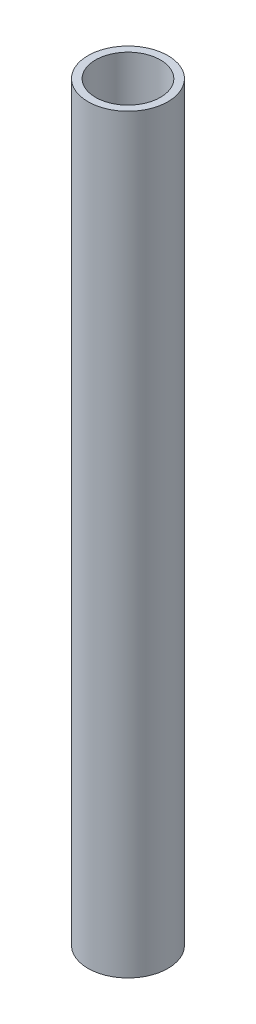
ISO-10303-21;
HEADER;
FILE_DESCRIPTION(('STEP AP214'),'2;1');
FILE_NAME('part.step','',(''),(''),'','','');
FILE_SCHEMA(('AUTOMOTIVE_DESIGN { 1 0 10303 214 1 1 1 1 }'));
ENDSEC;
DATA;
#1=APPLICATION_CONTEXT('core data for automotive mechanical design processes');
#2=APPLICATION_PROTOCOL_DEFINITION('international standard','automotive_design',2000,#1);
#3=PRODUCT_CONTEXT('',#1,'mechanical');
#4=PRODUCT('Part','Part','',(#3));
#5=PRODUCT_RELATED_PRODUCT_CATEGORY('part','',(#4));
#6=PRODUCT_DEFINITION_FORMATION('','',#4);
#7=PRODUCT_DEFINITION_CONTEXT('part definition',#1,'design');
#8=PRODUCT_DEFINITION('design','',#6,#7);
#9=PRODUCT_DEFINITION_SHAPE('','',#8);
#10=(LENGTH_UNIT() NAMED_UNIT(*) SI_UNIT(.MILLI.,.METRE.));
#11=(NAMED_UNIT(*) PLANE_ANGLE_UNIT() SI_UNIT($,.RADIAN.));
#12=(NAMED_UNIT(*) SI_UNIT($,.STERADIAN.) SOLID_ANGLE_UNIT());
#13=UNCERTAINTY_MEASURE_WITH_UNIT(LENGTH_MEASURE(1.E-05),#10,'distance_accuracy_value','');
#14=(GEOMETRIC_REPRESENTATION_CONTEXT(3) GLOBAL_UNCERTAINTY_ASSIGNED_CONTEXT((#13)) GLOBAL_UNIT_ASSIGNED_CONTEXT((#10,
#11,#12)) REPRESENTATION_CONTEXT('',''));
#15=CARTESIAN_POINT('',(0.,0.,0.));
#16=DIRECTION('',(0.,0.,1.));
#17=DIRECTION('',(1.,0.,0.));
#18=AXIS2_PLACEMENT_3D('',#15,#16,#17);
#19=CARTESIAN_POINT('',(2.45914399954472E-11,200.,1.50000000000004));
#20=DIRECTION('',(0.,1.,0.));
#21=DIRECTION('',(0.,0.,1.));
#22=AXIS2_PLACEMENT_3D('',#19,#20,#21);
#23=PLANE('',#22);
#24=CARTESIAN_POINT('',(2.45914399954472E-11,200.,1.50000000000004));
#25=DIRECTION('',(0.,1.,0.));
#26=DIRECTION('',(0.,0.,1.));
#27=AXIS2_PLACEMENT_3D('',#24,#25,#26);
#28=CIRCLE('',#27,10.65);
#29=CARTESIAN_POINT('',(2.45914399954472E-11,200.,12.15));
#30=VERTEX_POINT('',#29);
#31=EDGE_CURVE('E10',#30,#30,#28,.T.);
#32=ORIENTED_EDGE('',*,*,#31,.T.);
#33=EDGE_LOOP('',(#32));
#34=FACE_BOUND('',#33,.T.);
#35=CARTESIAN_POINT('',(2.45914399954472E-11,200.,1.50000000000004));
#36=DIRECTION('',(0.,1.,0.));
#37=DIRECTION('',(0.,0.,1.));
#38=AXIS2_PLACEMENT_3D('',#35,#36,#37);
#39=CIRCLE('',#38,8.65);
#40=CARTESIAN_POINT('',(2.45914399954472E-11,200.,10.15));
#41=VERTEX_POINT('',#40);
#42=EDGE_CURVE('E43',#41,#41,#39,.T.);
#43=ORIENTED_EDGE('',*,*,#42,.F.);
#44=EDGE_LOOP('',(#43));
#45=FACE_BOUND('',#44,.T.);
#46=ADVANCED_FACE('F32',(#34,#45),#23,.T.);
#47=CARTESIAN_POINT('',(2.45914399954472E-11,0.,1.50000000000004));
#48=DIRECTION('',(0.,1.,0.));
#49=DIRECTION('',(0.,0.,1.));
#50=AXIS2_PLACEMENT_3D('',#47,#48,#49);
#51=PLANE('',#50);
#52=CARTESIAN_POINT('',(2.45914399954472E-11,0.,1.50000000000004));
#53=DIRECTION('',(0.,1.,0.));
#54=DIRECTION('',(0.,0.,1.));
#55=AXIS2_PLACEMENT_3D('',#52,#53,#54);
#56=CIRCLE('',#55,10.65);
#57=CARTESIAN_POINT('',(2.45914399954472E-11,0.,12.15));
#58=VERTEX_POINT('',#57);
#59=EDGE_CURVE('E36',#58,#58,#56,.T.);
#60=ORIENTED_EDGE('',*,*,#59,.F.);
#61=EDGE_LOOP('',(#60));
#62=FACE_BOUND('',#61,.T.);
#63=CARTESIAN_POINT('',(2.45914399954472E-11,0.,1.50000000000004));
#64=DIRECTION('',(0.,1.,0.));
#65=DIRECTION('',(0.,0.,1.));
#66=AXIS2_PLACEMENT_3D('',#63,#64,#65);
#67=CIRCLE('',#66,8.65);
#68=CARTESIAN_POINT('',(2.45914399954472E-11,0.,10.15));
#69=VERTEX_POINT('',#68);
#70=EDGE_CURVE('E45',#69,#69,#67,.T.);
#71=ORIENTED_EDGE('',*,*,#70,.T.);
#72=EDGE_LOOP('',(#71));
#73=FACE_BOUND('',#72,.T.);
#74=ADVANCED_FACE('F55',(#62,#73),#51,.F.);
#75=CARTESIAN_POINT('',(2.45914399954472E-11,200.,1.50000000000004));
#76=DIRECTION('',(0.,-1.,0.));
#77=DIRECTION('',(0.,0.,-1.));
#78=AXIS2_PLACEMENT_3D('',#75,#76,#77);
#79=CYLINDRICAL_SURFACE('',#78,10.65);
#80=ORIENTED_EDGE('',*,*,#31,.F.);
#81=EDGE_LOOP('',(#80));
#82=FACE_BOUND('',#81,.T.);
#83=ORIENTED_EDGE('',*,*,#59,.T.);
#84=EDGE_LOOP('',(#83));
#85=FACE_BOUND('',#84,.T.);
#86=ADVANCED_FACE('F34',(#82,#85),#79,.T.);
#87=CARTESIAN_POINT('',(2.45914399954472E-11,200.,1.50000000000004));
#88=DIRECTION('',(0.,-1.,0.));
#89=DIRECTION('',(0.,0.,-1.));
#90=AXIS2_PLACEMENT_3D('',#87,#88,#89);
#91=CYLINDRICAL_SURFACE('',#90,8.65);
#92=ORIENTED_EDGE('',*,*,#42,.T.);
#93=EDGE_LOOP('',(#92));
#94=FACE_BOUND('',#93,.T.);
#95=ORIENTED_EDGE('',*,*,#70,.F.);
#96=EDGE_LOOP('',(#95));
#97=FACE_BOUND('',#96,.T.);
#98=ADVANCED_FACE('F51',(#94,#97),#91,.F.);
#99=CLOSED_SHELL('',(#46,#74,#86,#98));
#100=MANIFOLD_SOLID_BREP('B2',#99);
#101=ADVANCED_BREP_SHAPE_REPRESENTATION('',(#18,#100),#14);
#102=SHAPE_DEFINITION_REPRESENTATION(#9,#101);
ENDSEC;
END-ISO-10303-21;
